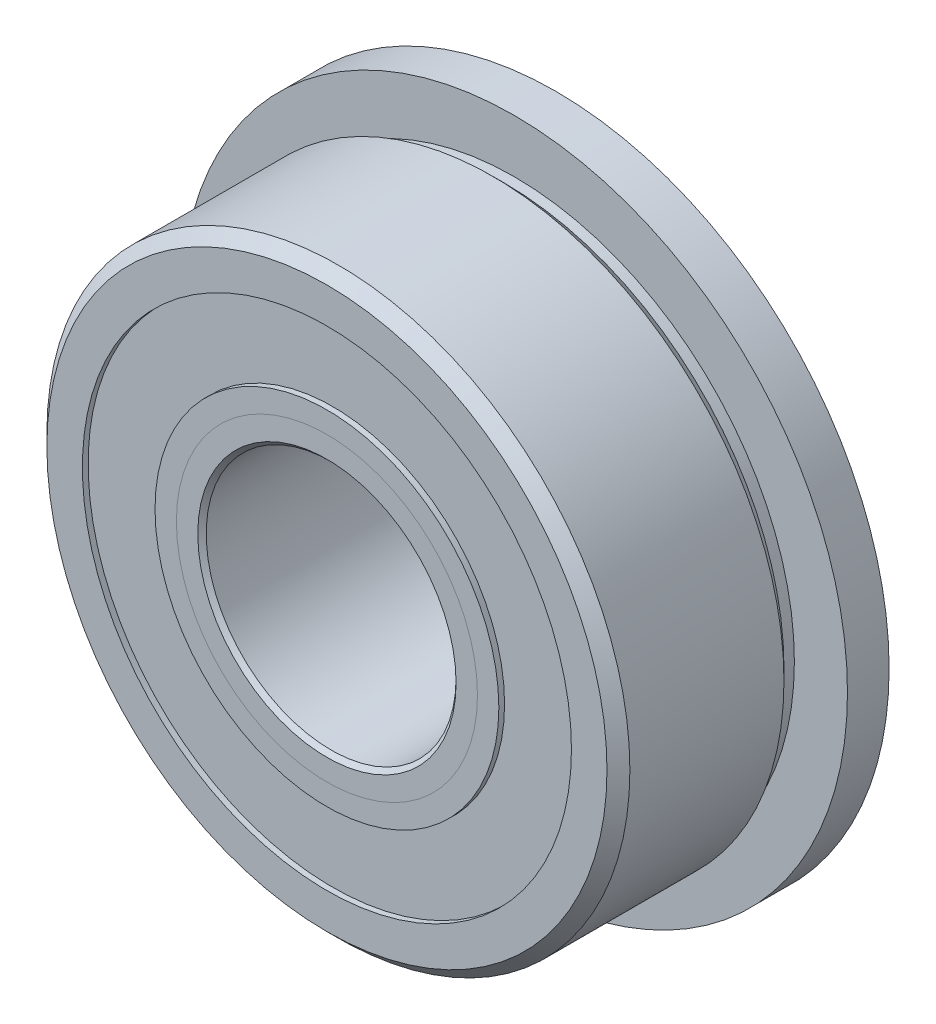
ISO-10303-21;
HEADER;
FILE_DESCRIPTION(('STEP AP214'),'2;1');
FILE_NAME('part.step','',(''),(''),'','','');
FILE_SCHEMA(('AUTOMOTIVE_DESIGN { 1 0 10303 214 1 1 1 1 }'));
ENDSEC;
DATA;
#1=APPLICATION_CONTEXT('core data for automotive mechanical design processes');
#2=APPLICATION_PROTOCOL_DEFINITION('international standard','automotive_design',2000,#1);
#3=PRODUCT_CONTEXT('',#1,'mechanical');
#4=PRODUCT('Part','Part','',(#3));
#5=PRODUCT_RELATED_PRODUCT_CATEGORY('part','',(#4));
#6=PRODUCT_DEFINITION_FORMATION('','',#4);
#7=PRODUCT_DEFINITION_CONTEXT('part definition',#1,'design');
#8=PRODUCT_DEFINITION('design','',#6,#7);
#9=PRODUCT_DEFINITION_SHAPE('','',#8);
#10=(LENGTH_UNIT() NAMED_UNIT(*) SI_UNIT(.MILLI.,.METRE.));
#11=(NAMED_UNIT(*) PLANE_ANGLE_UNIT() SI_UNIT($,.RADIAN.));
#12=(NAMED_UNIT(*) SI_UNIT($,.STERADIAN.) SOLID_ANGLE_UNIT());
#13=UNCERTAINTY_MEASURE_WITH_UNIT(LENGTH_MEASURE(1.E-05),#10,'distance_accuracy_value','');
#14=(GEOMETRIC_REPRESENTATION_CONTEXT(3) GLOBAL_UNCERTAINTY_ASSIGNED_CONTEXT((#13)) GLOBAL_UNIT_ASSIGNED_CONTEXT((#10,
#11,#12)) REPRESENTATION_CONTEXT('',''));
#15=CARTESIAN_POINT('',(0.,0.,0.));
#16=DIRECTION('',(0.,0.,1.));
#17=DIRECTION('',(1.,0.,0.));
#18=AXIS2_PLACEMENT_3D('',#15,#16,#17);
#19=CARTESIAN_POINT('',(0.,0.,4.365625));
#20=DIRECTION('',(0.,0.,1.));
#21=DIRECTION('',(1.,0.,0.));
#22=AXIS2_PLACEMENT_3D('',#19,#20,#21);
#23=CYLINDRICAL_SURFACE('',#22,5.9563);
#24=CARTESIAN_POINT('',(0.,0.,-2.85282807245589));
#25=DIRECTION('',(0.,0.,1.));
#26=DIRECTION('',(1.,0.,0.));
#27=AXIS2_PLACEMENT_3D('',#24,#25,#26);
#28=CIRCLE('',#27,5.9563);
#29=CARTESIAN_POINT('',(5.9563,0.,-2.85282807245589));
#30=VERTEX_POINT('',#29);
#31=EDGE_CURVE('E11',#30,#30,#28,.T.);
#32=ORIENTED_EDGE('',*,*,#31,.T.);
#33=EDGE_LOOP('',(#32));
#34=FACE_BOUND('',#33,.T.);
#35=CARTESIAN_POINT('',(0.,0.,-3.89334375));
#36=DIRECTION('',(0.,0.,-1.));
#37=DIRECTION('',(-1.,0.,0.));
#38=AXIS2_PLACEMENT_3D('',#35,#36,#37);
#39=CIRCLE('',#38,5.9563);
#40=CARTESIAN_POINT('',(-5.9563,0.,-3.89334375));
#41=VERTEX_POINT('',#40);
#42=EDGE_CURVE('E68',#41,#41,#39,.T.);
#43=ORIENTED_EDGE('',*,*,#42,.T.);
#44=EDGE_LOOP('',(#43));
#45=FACE_BOUND('',#44,.T.);
#46=ADVANCED_FACE('F47',(#34,#45),#23,.F.);
#47=CARTESIAN_POINT('',(0.,9.32147435897436,-4.14734375));
#48=DIRECTION('',(0.,0.,1.));
#49=DIRECTION('',(1.,0.,0.));
#50=AXIS2_PLACEMENT_3D('',#47,#48,#49);
#51=PLANE('',#50);
#52=CARTESIAN_POINT('',(0.,0.,-4.14734375));
#53=DIRECTION('',(0.,0.,-1.));
#54=DIRECTION('',(-1.,0.,0.));
#55=AXIS2_PLACEMENT_3D('',#52,#53,#54);
#56=CIRCLE('',#55,6.432804);
#57=CARTESIAN_POINT('',(-6.432804,0.,-4.14734375));
#58=VERTEX_POINT('',#57);
#59=EDGE_CURVE('E65',#58,#58,#56,.T.);
#60=ORIENTED_EDGE('',*,*,#59,.F.);
#61=EDGE_LOOP('',(#60));
#62=FACE_BOUND('',#61,.T.);
#63=CARTESIAN_POINT('',(0.,0.,-4.14734375));
#64=DIRECTION('',(0.,0.,1.));
#65=DIRECTION('',(1.,0.,0.));
#66=AXIS2_PLACEMENT_3D('',#63,#64,#65);
#67=CIRCLE('',#66,9.32147435897436);
#68=CARTESIAN_POINT('',(9.32147435897436,0.,-4.14734375));
#69=VERTEX_POINT('',#68);
#70=EDGE_CURVE('E58',#69,#69,#67,.T.);
#71=ORIENTED_EDGE('',*,*,#70,.F.);
#72=EDGE_LOOP('',(#71));
#73=FACE_BOUND('',#72,.T.);
#74=ADVANCED_FACE('F49',(#62,#73),#51,.F.);
#75=CARTESIAN_POINT('',(0.,9.32147435897436,-2.85282807245589));
#76=DIRECTION('',(0.,0.,-1.));
#77=DIRECTION('',(-1.,0.,0.));
#78=AXIS2_PLACEMENT_3D('',#75,#76,#77);
#79=PLANE('',#78);
#80=ORIENTED_EDGE('',*,*,#31,.F.);
#81=EDGE_LOOP('',(#80));
#82=FACE_BOUND('',#81,.T.);
#83=CARTESIAN_POINT('',(0.,0.,-2.85282807245589));
#84=DIRECTION('',(0.,0.,1.));
#85=DIRECTION('',(1.,0.,0.));
#86=AXIS2_PLACEMENT_3D('',#83,#84,#85);
#87=CIRCLE('',#86,9.32147435897436);
#88=CARTESIAN_POINT('',(9.32147435897436,0.,-2.85282807245589));
#89=VERTEX_POINT('',#88);
#90=EDGE_CURVE('E54',#89,#89,#87,.T.);
#91=ORIENTED_EDGE('',*,*,#90,.T.);
#92=EDGE_LOOP('',(#91));
#93=FACE_BOUND('',#92,.T.);
#94=ADVANCED_FACE('F90',(#82,#93),#79,.F.);
#95=CARTESIAN_POINT('',(0.,0.,4.365625));
#96=DIRECTION('',(0.,0.,1.));
#97=DIRECTION('',(1.,0.,0.));
#98=AXIS2_PLACEMENT_3D('',#95,#96,#97);
#99=CYLINDRICAL_SURFACE('',#98,9.32147435897436);
#100=ORIENTED_EDGE('',*,*,#90,.F.);
#101=EDGE_LOOP('',(#100));
#102=FACE_BOUND('',#101,.T.);
#103=ORIENTED_EDGE('',*,*,#70,.T.);
#104=EDGE_LOOP('',(#103));
#105=FACE_BOUND('',#104,.T.);
#106=ADVANCED_FACE('F84',(#102,#105),#99,.T.);
#107=CARTESIAN_POINT('',(0.,0.,-3.89334375));
#108=DIRECTION('',(0.,0.,-1.));
#109=DIRECTION('',(-1.,0.,0.));
#110=AXIS2_PLACEMENT_3D('',#107,#108,#109);
#111=CYLINDRICAL_SURFACE('',#110,6.432804);
#112=CARTESIAN_POINT('',(0.,0.,-3.89334375));
#113=DIRECTION('',(0.,0.,-1.));
#114=DIRECTION('',(-1.,0.,0.));
#115=AXIS2_PLACEMENT_3D('',#112,#113,#114);
#116=CIRCLE('',#115,6.432804);
#117=CARTESIAN_POINT('',(-6.432804,0.,-3.89334375));
#118=VERTEX_POINT('',#117);
#119=EDGE_CURVE('E62',#118,#118,#116,.T.);
#120=ORIENTED_EDGE('',*,*,#119,.F.);
#121=EDGE_LOOP('',(#120));
#122=FACE_BOUND('',#121,.T.);
#123=ORIENTED_EDGE('',*,*,#59,.T.);
#124=EDGE_LOOP('',(#123));
#125=FACE_BOUND('',#124,.T.);
#126=ADVANCED_FACE('F78',(#122,#125),#111,.F.);
#127=CARTESIAN_POINT('',(0.,0.,-3.89334375));
#128=DIRECTION('',(0.,0.,-1.));
#129=DIRECTION('',(-1.,0.,0.));
#130=AXIS2_PLACEMENT_3D('',#127,#128,#129);
#131=PLANE('',#130);
#132=ORIENTED_EDGE('',*,*,#42,.F.);
#133=EDGE_LOOP('',(#132));
#134=FACE_BOUND('',#133,.T.);
#135=ORIENTED_EDGE('',*,*,#119,.T.);
#136=EDGE_LOOP('',(#135));
#137=FACE_BOUND('',#136,.T.);
#138=ADVANCED_FACE('F75',(#134,#137),#131,.T.);
#139=CLOSED_SHELL('',(#46,#74,#94,#106,#126,#138));
#140=MANIFOLD_SOLID_BREP('B2',#139);
#141=CARTESIAN_POINT('',(0.,9.32147435897436,4.14734375));
#142=DIRECTION('',(0.,0.,-1.));
#143=DIRECTION('',(-1.,0.,0.));
#144=AXIS2_PLACEMENT_3D('',#141,#142,#143);
#145=PLANE('',#144);
#146=CARTESIAN_POINT('',(0.,0.,4.14734375));
#147=DIRECTION('',(0.,0.,1.));
#148=DIRECTION('',(1.,0.,0.));
#149=AXIS2_PLACEMENT_3D('',#146,#147,#148);
#150=CIRCLE('',#149,6.55352564102564);
#151=CARTESIAN_POINT('',(6.55352564102564,0.,4.14734375));
#152=VERTEX_POINT('',#151);
#153=EDGE_CURVE('E46',#152,#152,#150,.T.);
#154=ORIENTED_EDGE('',*,*,#153,.F.);
#155=EDGE_LOOP('',(#154));
#156=FACE_BOUND('',#155,.T.);
#157=CARTESIAN_POINT('',(0.,0.,4.14734375));
#158=DIRECTION('',(0.,0.,1.));
#159=DIRECTION('',(1.,0.,0.));
#160=AXIS2_PLACEMENT_3D('',#157,#158,#159);
#161=CIRCLE('',#160,9.32147435897436);
#162=CARTESIAN_POINT('',(9.32147435897436,0.,4.14734375));
#163=VERTEX_POINT('',#162);
#164=EDGE_CURVE('E174',#163,#163,#161,.T.);
#165=ORIENTED_EDGE('',*,*,#164,.T.);
#166=EDGE_LOOP('',(#165));
#167=FACE_BOUND('',#166,.T.);
#168=ADVANCED_FACE('F160',(#156,#167),#145,.F.);
#169=CARTESIAN_POINT('',(0.,0.,4.365625));
#170=DIRECTION('',(0.,0.,1.));
#171=DIRECTION('',(1.,0.,0.));
#172=AXIS2_PLACEMENT_3D('',#169,#170,#171);
#173=CYLINDRICAL_SURFACE('',#172,6.55352564102564);
#174=CARTESIAN_POINT('',(0.,0.,2.85282807245588));
#175=DIRECTION('',(0.,0.,1.));
#176=DIRECTION('',(1.,0.,0.));
#177=AXIS2_PLACEMENT_3D('',#174,#175,#176);
#178=CIRCLE('',#177,6.55352564102564);
#179=CARTESIAN_POINT('',(6.55352564102564,0.,2.85282807245588));
#180=VERTEX_POINT('',#179);
#181=EDGE_CURVE('E166',#180,#180,#178,.T.);
#182=ORIENTED_EDGE('',*,*,#181,.F.);
#183=EDGE_LOOP('',(#182));
#184=FACE_BOUND('',#183,.T.);
#185=ORIENTED_EDGE('',*,*,#153,.T.);
#186=EDGE_LOOP('',(#185));
#187=FACE_BOUND('',#186,.T.);
#188=ADVANCED_FACE('F189',(#184,#187),#173,.F.);
#189=CARTESIAN_POINT('',(0.,9.32147435897436,2.85282807245588));
#190=DIRECTION('',(0.,0.,1.));
#191=DIRECTION('',(1.,0.,0.));
#192=AXIS2_PLACEMENT_3D('',#189,#190,#191);
#193=PLANE('',#192);
#194=CARTESIAN_POINT('',(0.,0.,2.85282807245588));
#195=DIRECTION('',(0.,0.,1.));
#196=DIRECTION('',(1.,0.,0.));
#197=AXIS2_PLACEMENT_3D('',#194,#195,#196);
#198=CIRCLE('',#197,9.32147435897436);
#199=CARTESIAN_POINT('',(9.32147435897436,0.,2.85282807245588));
#200=VERTEX_POINT('',#199);
#201=EDGE_CURVE('E170',#200,#200,#198,.T.);
#202=ORIENTED_EDGE('',*,*,#201,.F.);
#203=EDGE_LOOP('',(#202));
#204=FACE_BOUND('',#203,.T.);
#205=ORIENTED_EDGE('',*,*,#181,.T.);
#206=EDGE_LOOP('',(#205));
#207=FACE_BOUND('',#206,.T.);
#208=ADVANCED_FACE('F184',(#204,#207),#193,.F.);
#209=CARTESIAN_POINT('',(0.,0.,4.365625));
#210=DIRECTION('',(0.,0.,1.));
#211=DIRECTION('',(1.,0.,0.));
#212=AXIS2_PLACEMENT_3D('',#209,#210,#211);
#213=CYLINDRICAL_SURFACE('',#212,9.32147435897436);
#214=ORIENTED_EDGE('',*,*,#164,.F.);
#215=EDGE_LOOP('',(#214));
#216=FACE_BOUND('',#215,.T.);
#217=ORIENTED_EDGE('',*,*,#201,.T.);
#218=EDGE_LOOP('',(#217));
#219=FACE_BOUND('',#218,.T.);
#220=ADVANCED_FACE('F181',(#216,#219),#213,.T.);
#221=CLOSED_SHELL('',(#168,#188,#208,#220));
#222=MANIFOLD_SOLID_BREP('B6',#221);
#223=CARTESIAN_POINT('',(-3.96874999999991,6.87407664253903,0.));
#224=DIRECTION('',(0.,0.,1.));
#225=DIRECTION('',(-0.499999999999989,0.866025403784445,0.));
#226=AXIS2_PLACEMENT_3D('',#223,#224,#225);
#227=SPHERICAL_SURFACE('',#226,2.85282807245588);
#228=CARTESIAN_POINT('',(-3.96874999999991,6.87407664253903,2.85282807245588));
#229=VERTEX_POINT('',#228);
#230=VERTEX_LOOP('',#229);
#231=FACE_BOUND('',#230,.T.);
#232=ADVANCED_FACE('F227',(#231),#227,.T.);
#233=CLOSED_SHELL('',(#232));
#234=MANIFOLD_SOLID_BREP('B41',#233);
#235=CARTESIAN_POINT('',(-6.87407664253894,3.96875000000008,0.));
#236=DIRECTION('',(0.,0.,1.));
#237=DIRECTION('',(-0.866025403784433,0.50000000000001,0.));
#238=AXIS2_PLACEMENT_3D('',#235,#236,#237);
#239=SPHERICAL_SURFACE('',#238,2.85282807245588);
#240=CARTESIAN_POINT('',(-6.87407664253894,3.96875000000008,2.85282807245588));
#241=VERTEX_POINT('',#240);
#242=VERTEX_LOOP('',#241);
#243=FACE_BOUND('',#242,.T.);
#244=ADVANCED_FACE('F245',(#243),#239,.T.);
#245=CLOSED_SHELL('',(#244));
#246=MANIFOLD_SOLID_BREP('B156',#245);
#247=CARTESIAN_POINT('',(-7.9375,0.,0.));
#248=DIRECTION('',(0.,0.,1.));
#249=DIRECTION('',(-1.,0.,0.));
#250=AXIS2_PLACEMENT_3D('',#247,#248,#249);
#251=SPHERICAL_SURFACE('',#250,2.85282807245588);
#252=CARTESIAN_POINT('',(-7.9375,0.,2.85282807245588));
#253=VERTEX_POINT('',#252);
#254=VERTEX_LOOP('',#253);
#255=FACE_BOUND('',#254,.T.);
#256=ADVANCED_FACE('F263',(#255),#251,.T.);
#257=CLOSED_SHELL('',(#256));
#258=MANIFOLD_SOLID_BREP('B223',#257);
#259=CARTESIAN_POINT('',(-6.87407664253902,-3.96874999999994,0.));
#260=DIRECTION('',(0.,0.,1.));
#261=DIRECTION('',(-0.866025403784443,-0.499999999999992,0.));
#262=AXIS2_PLACEMENT_3D('',#259,#260,#261);
#263=SPHERICAL_SURFACE('',#262,2.85282807245588);
#264=CARTESIAN_POINT('',(-6.87407664253902,-3.96874999999994,2.85282807245588));
#265=VERTEX_POINT('',#264);
#266=VERTEX_LOOP('',#265);
#267=FACE_BOUND('',#266,.T.);
#268=ADVANCED_FACE('F281',(#267),#263,.T.);
#269=CLOSED_SHELL('',(#268));
#270=MANIFOLD_SOLID_BREP('B241',#269);
#271=CARTESIAN_POINT('',(-3.96875000000006,-6.87407664253895,0.));
#272=DIRECTION('',(0.,0.,1.));
#273=DIRECTION('',(-0.500000000000007,-0.866025403784435,0.));
#274=AXIS2_PLACEMENT_3D('',#271,#272,#273);
#275=SPHERICAL_SURFACE('',#274,2.85282807245588);
#276=CARTESIAN_POINT('',(-3.96875000000006,-6.87407664253895,2.85282807245588));
#277=VERTEX_POINT('',#276);
#278=VERTEX_LOOP('',#277);
#279=FACE_BOUND('',#278,.T.);
#280=ADVANCED_FACE('F299',(#279),#275,.T.);
#281=CLOSED_SHELL('',(#280));
#282=MANIFOLD_SOLID_BREP('B259',#281);
#283=CARTESIAN_POINT('',(0.,-7.9375,0.));
#284=DIRECTION('',(0.,0.,1.));
#285=DIRECTION('',(0.,-1.,0.));
#286=AXIS2_PLACEMENT_3D('',#283,#284,#285);
#287=SPHERICAL_SURFACE('',#286,2.85282807245588);
#288=CARTESIAN_POINT('',(0.,-7.9375,2.85282807245588));
#289=VERTEX_POINT('',#288);
#290=VERTEX_LOOP('',#289);
#291=FACE_BOUND('',#290,.T.);
#292=ADVANCED_FACE('F317',(#291),#287,.T.);
#293=CLOSED_SHELL('',(#292));
#294=MANIFOLD_SOLID_BREP('B277',#293);
#295=CARTESIAN_POINT('',(3.96874999999996,-6.87407664253901,0.));
#296=DIRECTION('',(0.,0.,1.));
#297=DIRECTION('',(0.499999999999995,-0.866025403784442,0.));
#298=AXIS2_PLACEMENT_3D('',#295,#296,#297);
#299=SPHERICAL_SURFACE('',#298,2.85282807245588);
#300=CARTESIAN_POINT('',(3.96874999999996,-6.87407664253901,2.85282807245588));
#301=VERTEX_POINT('',#300);
#302=VERTEX_LOOP('',#301);
#303=FACE_BOUND('',#302,.T.);
#304=ADVANCED_FACE('F335',(#303),#299,.T.);
#305=CLOSED_SHELL('',(#304));
#306=MANIFOLD_SOLID_BREP('B295',#305);
#307=CARTESIAN_POINT('',(6.87407664253896,-3.96875000000003,0.));
#308=DIRECTION('',(0.,0.,1.));
#309=DIRECTION('',(0.866025403784436,-0.500000000000004,0.));
#310=AXIS2_PLACEMENT_3D('',#307,#308,#309);
#311=SPHERICAL_SURFACE('',#310,2.85282807245588);
#312=CARTESIAN_POINT('',(6.87407664253896,-3.96875000000003,2.85282807245588));
#313=VERTEX_POINT('',#312);
#314=VERTEX_LOOP('',#313);
#315=FACE_BOUND('',#314,.T.);
#316=ADVANCED_FACE('F353',(#315),#311,.T.);
#317=CLOSED_SHELL('',(#316));
#318=MANIFOLD_SOLID_BREP('B313',#317);
#319=CARTESIAN_POINT('',(7.9375,0.,0.));
#320=DIRECTION('',(0.,0.,1.));
#321=DIRECTION('',(1.,0.,0.));
#322=AXIS2_PLACEMENT_3D('',#319,#320,#321);
#323=SPHERICAL_SURFACE('',#322,2.85282807245588);
#324=CARTESIAN_POINT('',(7.9375,0.,2.85282807245588));
#325=VERTEX_POINT('',#324);
#326=VERTEX_LOOP('',#325);
#327=FACE_BOUND('',#326,.T.);
#328=ADVANCED_FACE('F371',(#327),#323,.T.);
#329=CLOSED_SHELL('',(#328));
#330=MANIFOLD_SOLID_BREP('B331',#329);
#331=CARTESIAN_POINT('',(6.87407664253899,3.96874999999998,0.));
#332=DIRECTION('',(0.,0.,1.));
#333=DIRECTION('',(0.86602540378444,0.499999999999998,0.));
#334=AXIS2_PLACEMENT_3D('',#331,#332,#333);
#335=SPHERICAL_SURFACE('',#334,2.85282807245588);
#336=CARTESIAN_POINT('',(6.87407664253899,3.96874999999998,2.85282807245588));
#337=VERTEX_POINT('',#336);
#338=VERTEX_LOOP('',#337);
#339=FACE_BOUND('',#338,.T.);
#340=ADVANCED_FACE('F389',(#339),#335,.T.);
#341=CLOSED_SHELL('',(#340));
#342=MANIFOLD_SOLID_BREP('B349',#341);
#343=CARTESIAN_POINT('',(3.96875000000001,6.87407664253898,0.));
#344=DIRECTION('',(0.,0.,1.));
#345=DIRECTION('',(0.500000000000001,0.866025403784438,0.));
#346=AXIS2_PLACEMENT_3D('',#343,#344,#345);
#347=SPHERICAL_SURFACE('',#346,2.85282807245588);
#348=CARTESIAN_POINT('',(3.96875000000001,6.87407664253898,2.85282807245588));
#349=VERTEX_POINT('',#348);
#350=VERTEX_LOOP('',#349);
#351=FACE_BOUND('',#350,.T.);
#352=ADVANCED_FACE('F407',(#351),#347,.T.);
#353=CLOSED_SHELL('',(#352));
#354=MANIFOLD_SOLID_BREP('B367',#353);
#355=CARTESIAN_POINT('',(0.,7.9375,0.));
#356=DIRECTION('',(0.,0.,1.));
#357=DIRECTION('',(0.,1.,0.));
#358=AXIS2_PLACEMENT_3D('',#355,#356,#357);
#359=SPHERICAL_SURFACE('',#358,2.85282807245588);
#360=CARTESIAN_POINT('',(0.,7.9375,2.85282807245588));
#361=VERTEX_POINT('',#360);
#362=VERTEX_LOOP('',#361);
#363=FACE_BOUND('',#362,.T.);
#364=ADVANCED_FACE('F427',(#363),#359,.T.);
#365=CLOSED_SHELL('',(#364));
#366=MANIFOLD_SOLID_BREP('B385',#365);
#367=CARTESIAN_POINT('',(0.,5.1990625,-5.953125));
#368=DIRECTION('',(0.,0.,1.));
#369=DIRECTION('',(1.,0.,0.));
#370=AXIS2_PLACEMENT_3D('',#367,#368,#369);
#371=PLANE('',#370);
#372=CARTESIAN_POINT('',(0.,0.,-5.953125));
#373=DIRECTION('',(0.,0.,1.));
#374=DIRECTION('',(1.,0.,0.));
#375=AXIS2_PLACEMENT_3D('',#372,#373,#374);
#376=CIRCLE('',#375,5.1990625);
#377=CARTESIAN_POINT('',(5.1990625,0.,-5.953125));
#378=VERTEX_POINT('',#377);
#379=EDGE_CURVE('E473',#378,#378,#376,.T.);
#380=ORIENTED_EDGE('',*,*,#379,.T.);
#381=EDGE_LOOP('',(#380));
#382=FACE_BOUND('',#381,.T.);
#383=CARTESIAN_POINT('',(0.,0.,-5.953125));
#384=DIRECTION('',(0.,0.,-1.));
#385=DIRECTION('',(-1.,0.,0.));
#386=AXIS2_PLACEMENT_3D('',#383,#384,#385);
#387=CIRCLE('',#386,5.45855525);
#388=CARTESIAN_POINT('',(-5.45855525,0.,-5.953125));
#389=VERTEX_POINT('',#388);
#390=EDGE_CURVE('E492',#389,#389,#387,.T.);
#391=ORIENTED_EDGE('',*,*,#390,.T.);
#392=EDGE_LOOP('',(#391));
#393=FACE_BOUND('',#392,.T.);
#394=ADVANCED_FACE('F447',(#382,#393),#371,.F.);
#395=CARTESIAN_POINT('',(0.,5.73855580239885,4.365625));
#396=DIRECTION('',(0.,0.,-1.));
#397=DIRECTION('',(-1.,0.,0.));
#398=AXIS2_PLACEMENT_3D('',#395,#396,#397);
#399=PLANE('',#398);
#400=CARTESIAN_POINT('',(0.,0.,4.365625));
#401=DIRECTION('',(0.,0.,1.));
#402=DIRECTION('',(1.,0.,0.));
#403=AXIS2_PLACEMENT_3D('',#400,#401,#402);
#404=CIRCLE('',#403,4.92358596377206);
#405=CARTESIAN_POINT('',(4.92358596377206,0.,4.365625));
#406=VERTEX_POINT('',#405);
#407=EDGE_CURVE('E482',#406,#406,#404,.T.);
#408=ORIENTED_EDGE('',*,*,#407,.F.);
#409=EDGE_LOOP('',(#408));
#410=FACE_BOUND('',#409,.T.);
#411=CARTESIAN_POINT('',(0.,0.,4.365625));
#412=DIRECTION('',(0.,0.,1.));
#413=DIRECTION('',(1.,0.,0.));
#414=AXIS2_PLACEMENT_3D('',#411,#412,#413);
#415=CIRCLE('',#414,5.73855580239885);
#416=CARTESIAN_POINT('',(5.73855580239885,0.,4.365625));
#417=VERTEX_POINT('',#416);
#418=EDGE_CURVE('E426',#417,#417,#415,.T.);
#419=ORIENTED_EDGE('',*,*,#418,.T.);
#420=EDGE_LOOP('',(#419));
#421=FACE_BOUND('',#420,.T.);
#422=ADVANCED_FACE('F449',(#410,#421),#399,.F.);
#423=CARTESIAN_POINT('',(0.,0.,3.55065516137321));
#424=DIRECTION('',(0.,0.,1.));
#425=DIRECTION('',(1.,0.,0.));
#426=AXIS2_PLACEMENT_3D('',#423,#424,#425);
#427=CONICAL_SURFACE('',#426,4.92358596377206,0.78539816339745);
#428=ORIENTED_EDGE('',*,*,#418,.F.);
#429=EDGE_LOOP('',(#428));
#430=FACE_BOUND('',#429,.T.);
#431=CARTESIAN_POINT('',(0.,0.,3.55065516137321));
#432=DIRECTION('',(0.,0.,1.));
#433=DIRECTION('',(1.,0.,0.));
#434=AXIS2_PLACEMENT_3D('',#431,#432,#433);
#435=CIRCLE('',#434,4.92358596377206);
#436=CARTESIAN_POINT('',(4.92358596377206,0.,3.55065516137321));
#437=VERTEX_POINT('',#436);
#438=EDGE_CURVE('E454',#437,#437,#435,.T.);
#439=ORIENTED_EDGE('',*,*,#438,.T.);
#440=EDGE_LOOP('',(#439));
#441=FACE_BOUND('',#440,.T.);
#442=ADVANCED_FACE('F538',(#430,#441),#427,.T.);
#443=CARTESIAN_POINT('',(0.,0.,4.365625));
#444=DIRECTION('',(0.,0.,1.));
#445=DIRECTION('',(1.,0.,0.));
#446=AXIS2_PLACEMENT_3D('',#443,#444,#445);
#447=CYLINDRICAL_SURFACE('',#446,4.92358596377206);
#448=ORIENTED_EDGE('',*,*,#438,.F.);
#449=EDGE_LOOP('',(#448));
#450=FACE_BOUND('',#449,.T.);
#451=CARTESIAN_POINT('',(0.,0.,0.));
#452=DIRECTION('',(0.,0.,1.));
#453=DIRECTION('',(1.,0.,0.));
#454=AXIS2_PLACEMENT_3D('',#451,#452,#453);
#455=CIRCLE('',#454,4.92358596377206);
#456=CARTESIAN_POINT('',(4.92358596377206,0.,0.));
#457=VERTEX_POINT('',#456);
#458=EDGE_CURVE('E458',#457,#457,#455,.T.);
#459=ORIENTED_EDGE('',*,*,#458,.T.);
#460=EDGE_LOOP('',(#459));
#461=FACE_BOUND('',#460,.T.);
#462=ADVANCED_FACE('F614',(#450,#461),#447,.T.);
#463=CARTESIAN_POINT('',(0.,4.92358596377206,0.));
#464=DIRECTION('',(0.,0.,-1.));
#465=DIRECTION('',(-1.,0.,0.));
#466=AXIS2_PLACEMENT_3D('',#463,#464,#465);
#467=PLANE('',#466);
#468=ORIENTED_EDGE('',*,*,#458,.F.);
#469=EDGE_LOOP('',(#468));
#470=FACE_BOUND('',#469,.T.);
#471=CARTESIAN_POINT('',(0.,0.,0.));
#472=DIRECTION('',(0.,0.,1.));
#473=DIRECTION('',(1.,0.,0.));
#474=AXIS2_PLACEMENT_3D('',#471,#472,#473);
#475=CIRCLE('',#474,5.08467192754412);
#476=CARTESIAN_POINT('',(5.08467192754412,0.,0.));
#477=VERTEX_POINT('',#476);
#478=EDGE_CURVE('E462',#477,#477,#475,.T.);
#479=ORIENTED_EDGE('',*,*,#478,.T.);
#480=EDGE_LOOP('',(#479));
#481=FACE_BOUND('',#480,.T.);
#482=ADVANCED_FACE('F529',(#470,#481),#467,.F.);
#483=CARTESIAN_POINT('',(0.,0.,0.));
#484=DIRECTION('',(0.,0.,1.));
#485=DIRECTION('',(1.,0.,0.));
#486=AXIS2_PLACEMENT_3D('',#483,#484,#485);
#487=TOROIDAL_SURFACE('',#486,7.9375,2.85282807245588);
#488=ORIENTED_EDGE('',*,*,#478,.F.);
#489=EDGE_LOOP('',(#488));
#490=FACE_BOUND('',#489,.T.);
#491=CARTESIAN_POINT('',(0.,0.,-2.05267497938479));
#492=DIRECTION('',(0.,0.,1.));
#493=DIRECTION('',(1.,0.,0.));
#494=AXIS2_PLACEMENT_3D('',#491,#492,#493);
#495=CIRCLE('',#494,5.9563);
#496=CARTESIAN_POINT('',(5.9563,0.,-2.05267497938479));
#497=VERTEX_POINT('',#496);
#498=EDGE_CURVE('E467',#497,#497,#495,.T.);
#499=ORIENTED_EDGE('',*,*,#498,.T.);
#500=EDGE_LOOP('',(#499));
#501=FACE_BOUND('',#500,.T.);
#502=ADVANCED_FACE('F523',(#490,#501),#487,.F.);
#503=CARTESIAN_POINT('',(0.,0.,4.365625));
#504=DIRECTION('',(0.,0.,1.));
#505=DIRECTION('',(1.,0.,0.));
#506=AXIS2_PLACEMENT_3D('',#503,#504,#505);
#507=CYLINDRICAL_SURFACE('',#506,5.9563);
#508=ORIENTED_EDGE('',*,*,#498,.F.);
#509=EDGE_LOOP('',(#508));
#510=FACE_BOUND('',#509,.T.);
#511=CARTESIAN_POINT('',(0.,0.,-5.953125));
#512=DIRECTION('',(0.,0.,1.));
#513=DIRECTION('',(1.,0.,0.));
#514=AXIS2_PLACEMENT_3D('',#511,#512,#513);
#515=CIRCLE('',#514,5.9563);
#516=CARTESIAN_POINT('',(5.9563,0.,-5.953125));
#517=VERTEX_POINT('',#516);
#518=EDGE_CURVE('E470',#517,#517,#515,.T.);
#519=ORIENTED_EDGE('',*,*,#518,.T.);
#520=EDGE_LOOP('',(#519));
#521=FACE_BOUND('',#520,.T.);
#522=ADVANCED_FACE('F518',(#510,#521),#507,.T.);
#523=CARTESIAN_POINT('',(0.,0.,-5.953125));
#524=DIRECTION('',(0.,0.,-1.));
#525=DIRECTION('',(-1.,0.,0.));
#526=AXIS2_PLACEMENT_3D('',#523,#524,#525);
#527=CIRCLE('',#526,5.69680725);
#528=CARTESIAN_POINT('',(-5.69680725,0.,-5.953125));
#529=VERTEX_POINT('',#528);
#530=EDGE_CURVE('E486',#529,#529,#527,.T.);
#531=ORIENTED_EDGE('',*,*,#530,.F.);
#532=EDGE_LOOP('',(#531));
#533=FACE_BOUND('',#532,.T.);
#534=ORIENTED_EDGE('',*,*,#518,.F.);
#535=EDGE_LOOP('',(#534));
#536=FACE_BOUND('',#535,.T.);
#537=ADVANCED_FACE('F514',(#533,#536),#371,.F.);
#538=CARTESIAN_POINT('',(0.,0.,-5.5165625));
#539=DIRECTION('',(0.,0.,-1.));
#540=DIRECTION('',(-1.,0.,0.));
#541=AXIS2_PLACEMENT_3D('',#538,#539,#540);
#542=CONICAL_SURFACE('',#541,4.7625,0.785398163397448);
#543=ORIENTED_EDGE('',*,*,#379,.F.);
#544=EDGE_LOOP('',(#543));
#545=FACE_BOUND('',#544,.T.);
#546=CARTESIAN_POINT('',(0.,0.,-5.5165625));
#547=DIRECTION('',(0.,0.,1.));
#548=DIRECTION('',(1.,0.,0.));
#549=AXIS2_PLACEMENT_3D('',#546,#547,#548);
#550=CIRCLE('',#549,4.7625);
#551=CARTESIAN_POINT('',(4.7625,0.,-5.5165625));
#552=VERTEX_POINT('',#551);
#553=EDGE_CURVE('E476',#552,#552,#550,.T.);
#554=ORIENTED_EDGE('',*,*,#553,.T.);
#555=EDGE_LOOP('',(#554));
#556=FACE_BOUND('',#555,.T.);
#557=ADVANCED_FACE('F517',(#545,#556),#542,.F.);
#558=CARTESIAN_POINT('',(0.,0.,4.365625));
#559=DIRECTION('',(0.,0.,1.));
#560=DIRECTION('',(1.,0.,0.));
#561=AXIS2_PLACEMENT_3D('',#558,#559,#560);
#562=CYLINDRICAL_SURFACE('',#561,4.7625);
#563=ORIENTED_EDGE('',*,*,#553,.F.);
#564=EDGE_LOOP('',(#563));
#565=FACE_BOUND('',#564,.T.);
#566=CARTESIAN_POINT('',(0.,0.,4.20453903622794));
#567=DIRECTION('',(0.,0.,1.));
#568=DIRECTION('',(1.,0.,0.));
#569=AXIS2_PLACEMENT_3D('',#566,#567,#568);
#570=CIRCLE('',#569,4.7625);
#571=CARTESIAN_POINT('',(4.7625,0.,4.20453903622794));
#572=VERTEX_POINT('',#571);
#573=EDGE_CURVE('E479',#572,#572,#570,.T.);
#574=ORIENTED_EDGE('',*,*,#573,.T.);
#575=EDGE_LOOP('',(#574));
#576=FACE_BOUND('',#575,.T.);
#577=ADVANCED_FACE('F544',(#565,#576),#562,.F.);
#578=CARTESIAN_POINT('',(0.,0.,4.365625));
#579=DIRECTION('',(0.,0.,1.));
#580=DIRECTION('',(1.,0.,0.));
#581=AXIS2_PLACEMENT_3D('',#578,#579,#580);
#582=CONICAL_SURFACE('',#581,4.92358596377206,0.785398163397448);
#583=ORIENTED_EDGE('',*,*,#573,.F.);
#584=EDGE_LOOP('',(#583));
#585=FACE_BOUND('',#584,.T.);
#586=ORIENTED_EDGE('',*,*,#407,.T.);
#587=EDGE_LOOP('',(#586));
#588=FACE_BOUND('',#587,.T.);
#589=ADVANCED_FACE('F510',(#585,#588),#582,.F.);
#590=CARTESIAN_POINT('',(0.,0.,-5.826125));
#591=DIRECTION('',(0.,0.,-1.));
#592=DIRECTION('',(-1.,0.,0.));
#593=AXIS2_PLACEMENT_3D('',#590,#591,#592);
#594=CYLINDRICAL_SURFACE('',#593,5.69680725);
#595=CARTESIAN_POINT('',(0.,0.,-5.826125));
#596=DIRECTION('',(0.,0.,-1.));
#597=DIRECTION('',(-1.,0.,0.));
#598=AXIS2_PLACEMENT_3D('',#595,#596,#597);
#599=CIRCLE('',#598,5.69680725);
#600=CARTESIAN_POINT('',(-5.69680725,0.,-5.826125));
#601=VERTEX_POINT('',#600);
#602=EDGE_CURVE('E485',#601,#601,#599,.T.);
#603=ORIENTED_EDGE('',*,*,#602,.F.);
#604=EDGE_LOOP('',(#603));
#605=FACE_BOUND('',#604,.T.);
#606=ORIENTED_EDGE('',*,*,#530,.T.);
#607=EDGE_LOOP('',(#606));
#608=FACE_BOUND('',#607,.T.);
#609=ADVANCED_FACE('F504',(#605,#608),#594,.F.);
#610=CARTESIAN_POINT('',(0.,0.,-5.826125));
#611=DIRECTION('',(0.,0.,-1.));
#612=DIRECTION('',(-1.,0.,0.));
#613=AXIS2_PLACEMENT_3D('',#610,#611,#612);
#614=PLANE('',#613);
#615=CARTESIAN_POINT('',(0.,0.,-5.826125));
#616=DIRECTION('',(0.,0.,-1.));
#617=DIRECTION('',(-1.,0.,0.));
#618=AXIS2_PLACEMENT_3D('',#615,#616,#617);
#619=CIRCLE('',#618,5.45855525);
#620=CARTESIAN_POINT('',(-5.45855525,0.,-5.826125));
#621=VERTEX_POINT('',#620);
#622=EDGE_CURVE('E489',#621,#621,#619,.T.);
#623=ORIENTED_EDGE('',*,*,#622,.F.);
#624=EDGE_LOOP('',(#623));
#625=FACE_BOUND('',#624,.T.);
#626=ORIENTED_EDGE('',*,*,#602,.T.);
#627=EDGE_LOOP('',(#626));
#628=FACE_BOUND('',#627,.T.);
#629=ADVANCED_FACE('F501',(#625,#628),#614,.T.);
#630=CARTESIAN_POINT('',(0.,0.,-5.826125));
#631=DIRECTION('',(0.,0.,-1.));
#632=DIRECTION('',(-1.,0.,0.));
#633=AXIS2_PLACEMENT_3D('',#630,#631,#632);
#634=CYLINDRICAL_SURFACE('',#633,5.45855525);
#635=ORIENTED_EDGE('',*,*,#622,.T.);
#636=EDGE_LOOP('',(#635));
#637=FACE_BOUND('',#636,.T.);
#638=ORIENTED_EDGE('',*,*,#390,.F.);
#639=EDGE_LOOP('',(#638));
#640=FACE_BOUND('',#639,.T.);
#641=ADVANCED_FACE('F498',(#637,#640),#634,.T.);
#642=CLOSED_SHELL('',(#394,#422,#442,#462,#482,#502,#522,#537,#557,#577,#589,#609,#629,#641));
#643=MANIFOLD_SOLID_BREP('B403',#642);
#644=CARTESIAN_POINT('',(0.,6.55352564102564,4.365625));
#645=DIRECTION('',(0.,0.,-1.));
#646=DIRECTION('',(-1.,0.,0.));
#647=AXIS2_PLACEMENT_3D('',#644,#645,#646);
#648=PLANE('',#647);
#649=CARTESIAN_POINT('',(0.,0.,4.365625));
#650=DIRECTION('',(0.,0.,1.));
#651=DIRECTION('',(1.,0.,0.));
#652=AXIS2_PLACEMENT_3D('',#649,#650,#651);
#653=CIRCLE('',#652,5.73855580239885);
#654=CARTESIAN_POINT('',(5.73855580239885,0.,4.365625));
#655=VERTEX_POINT('',#654);
#656=EDGE_CURVE('E446',#655,#655,#653,.T.);
#657=ORIENTED_EDGE('',*,*,#656,.F.);
#658=EDGE_LOOP('',(#657));
#659=FACE_BOUND('',#658,.T.);
#660=CARTESIAN_POINT('',(0.,0.,4.365625));
#661=DIRECTION('',(0.,0.,1.));
#662=DIRECTION('',(1.,0.,0.));
#663=AXIS2_PLACEMENT_3D('',#660,#661,#662);
#664=CIRCLE('',#663,6.55352564102564);
#665=CARTESIAN_POINT('',(6.55352564102564,0.,4.365625));
#666=VERTEX_POINT('',#665);
#667=EDGE_CURVE('E686',#666,#666,#664,.T.);
#668=ORIENTED_EDGE('',*,*,#667,.T.);
#669=EDGE_LOOP('',(#668));
#670=FACE_BOUND('',#669,.T.);
#671=ADVANCED_FACE('F664',(#659,#670),#648,.F.);
#672=CARTESIAN_POINT('',(0.,0.,4.365625));
#673=DIRECTION('',(0.,0.,1.));
#674=DIRECTION('',(1.,0.,0.));
#675=AXIS2_PLACEMENT_3D('',#672,#673,#674);
#676=CONICAL_SURFACE('',#675,5.73855580239885,0.78539816339745);
#677=CARTESIAN_POINT('',(0.,0.,3.55065516137321));
#678=DIRECTION('',(0.,0.,1.));
#679=DIRECTION('',(1.,0.,0.));
#680=AXIS2_PLACEMENT_3D('',#677,#678,#679);
#681=CIRCLE('',#680,4.92358596377206);
#682=CARTESIAN_POINT('',(4.92358596377206,0.,3.55065516137321));
#683=VERTEX_POINT('',#682);
#684=EDGE_CURVE('E670',#683,#683,#681,.T.);
#685=ORIENTED_EDGE('',*,*,#684,.F.);
#686=EDGE_LOOP('',(#685));
#687=FACE_BOUND('',#686,.T.);
#688=ORIENTED_EDGE('',*,*,#656,.T.);
#689=EDGE_LOOP('',(#688));
#690=FACE_BOUND('',#689,.T.);
#691=ADVANCED_FACE('F711',(#687,#690),#676,.F.);
#692=CARTESIAN_POINT('',(0.,0.,4.365625));
#693=DIRECTION('',(0.,0.,1.));
#694=DIRECTION('',(1.,0.,0.));
#695=AXIS2_PLACEMENT_3D('',#692,#693,#694);
#696=CYLINDRICAL_SURFACE('',#695,4.92358596377206);
#697=CARTESIAN_POINT('',(0.,0.,0.));
#698=DIRECTION('',(0.,0.,1.));
#699=DIRECTION('',(1.,0.,0.));
#700=AXIS2_PLACEMENT_3D('',#697,#698,#699);
#701=CIRCLE('',#700,4.92358596377206);
#702=CARTESIAN_POINT('',(4.92358596377206,0.,0.));
#703=VERTEX_POINT('',#702);
#704=EDGE_CURVE('E674',#703,#703,#701,.T.);
#705=ORIENTED_EDGE('',*,*,#704,.F.);
#706=EDGE_LOOP('',(#705));
#707=FACE_BOUND('',#706,.T.);
#708=ORIENTED_EDGE('',*,*,#684,.T.);
#709=EDGE_LOOP('',(#708));
#710=FACE_BOUND('',#709,.T.);
#711=ADVANCED_FACE('F706',(#707,#710),#696,.F.);
#712=CARTESIAN_POINT('',(0.,4.92358596377206,0.));
#713=DIRECTION('',(0.,0.,1.));
#714=DIRECTION('',(1.,0.,0.));
#715=AXIS2_PLACEMENT_3D('',#712,#713,#714);
#716=PLANE('',#715);
#717=CARTESIAN_POINT('',(0.,0.,0.));
#718=DIRECTION('',(0.,0.,1.));
#719=DIRECTION('',(1.,0.,0.));
#720=AXIS2_PLACEMENT_3D('',#717,#718,#719);
#721=CIRCLE('',#720,5.08467192754412);
#722=CARTESIAN_POINT('',(5.08467192754412,0.,0.));
#723=VERTEX_POINT('',#722);
#724=EDGE_CURVE('E678',#723,#723,#721,.T.);
#725=ORIENTED_EDGE('',*,*,#724,.F.);
#726=EDGE_LOOP('',(#725));
#727=FACE_BOUND('',#726,.T.);
#728=ORIENTED_EDGE('',*,*,#704,.T.);
#729=EDGE_LOOP('',(#728));
#730=FACE_BOUND('',#729,.T.);
#731=ADVANCED_FACE('F700',(#727,#730),#716,.F.);
#732=CARTESIAN_POINT('',(0.,0.,0.));
#733=DIRECTION('',(0.,0.,1.));
#734=DIRECTION('',(1.,0.,0.));
#735=AXIS2_PLACEMENT_3D('',#732,#733,#734);
#736=TOROIDAL_SURFACE('',#735,7.9375,2.85282807245588);
#737=CARTESIAN_POINT('',(0.,0.,2.49464285714286));
#738=DIRECTION('',(0.,0.,1.));
#739=DIRECTION('',(1.,0.,0.));
#740=AXIS2_PLACEMENT_3D('',#737,#738,#739);
#741=CIRCLE('',#740,6.55352564102564);
#742=CARTESIAN_POINT('',(6.55352564102564,0.,2.49464285714286));
#743=VERTEX_POINT('',#742);
#744=EDGE_CURVE('E683',#743,#743,#741,.T.);
#745=ORIENTED_EDGE('',*,*,#744,.F.);
#746=EDGE_LOOP('',(#745));
#747=FACE_BOUND('',#746,.T.);
#748=ORIENTED_EDGE('',*,*,#724,.T.);
#749=EDGE_LOOP('',(#748));
#750=FACE_BOUND('',#749,.T.);
#751=ADVANCED_FACE('F694',(#747,#750),#736,.F.);
#752=CARTESIAN_POINT('',(0.,0.,4.365625));
#753=DIRECTION('',(0.,0.,1.));
#754=DIRECTION('',(1.,0.,0.));
#755=AXIS2_PLACEMENT_3D('',#752,#753,#754);
#756=CYLINDRICAL_SURFACE('',#755,6.55352564102564);
#757=ORIENTED_EDGE('',*,*,#667,.F.);
#758=EDGE_LOOP('',(#757));
#759=FACE_BOUND('',#758,.T.);
#760=ORIENTED_EDGE('',*,*,#744,.T.);
#761=EDGE_LOOP('',(#760));
#762=FACE_BOUND('',#761,.T.);
#763=ADVANCED_FACE('F691',(#759,#762),#756,.T.);
#764=CLOSED_SHELL('',(#671,#691,#711,#731,#751,#763));
#765=MANIFOLD_SOLID_BREP('B421',#764);
#766=CARTESIAN_POINT('',(0.,0.,4.365625));
#767=DIRECTION('',(0.,0.,1.));
#768=DIRECTION('',(1.,0.,0.));
#769=AXIS2_PLACEMENT_3D('',#766,#767,#768);
#770=CYLINDRICAL_SURFACE('',#769,11.1125);
#771=CARTESIAN_POINT('',(0.,0.,3.9290625));
#772=DIRECTION('',(0.,0.,1.));
#773=DIRECTION('',(1.,0.,0.));
#774=AXIS2_PLACEMENT_3D('',#771,#772,#773);
#775=CIRCLE('',#774,11.1125);
#776=CARTESIAN_POINT('',(11.1125,0.,3.9290625));
#777=VERTEX_POINT('',#776);
#778=EDGE_CURVE('E766',#777,#777,#775,.T.);
#779=ORIENTED_EDGE('',*,*,#778,.F.);
#780=EDGE_LOOP('',(#779));
#781=FACE_BOUND('',#780,.T.);
#782=CARTESIAN_POINT('',(0.,0.,-1.9446875));
#783=DIRECTION('',(0.,0.,1.));
#784=DIRECTION('',(1.,0.,0.));
#785=AXIS2_PLACEMENT_3D('',#782,#783,#784);
#786=CIRCLE('',#785,11.1125);
#787=CARTESIAN_POINT('',(11.1125,0.,-1.9446875));
#788=VERTEX_POINT('',#787);
#789=EDGE_CURVE('E793',#788,#788,#786,.T.);
#790=ORIENTED_EDGE('',*,*,#789,.T.);
#791=EDGE_LOOP('',(#790));
#792=FACE_BOUND('',#791,.T.);
#793=ADVANCED_FACE('F755',(#781,#792),#770,.T.);
#794=CARTESIAN_POINT('',(0.,0.,0.));
#795=DIRECTION('',(0.,0.,1.));
#796=DIRECTION('',(1.,0.,0.));
#797=AXIS2_PLACEMENT_3D('',#794,#795,#796);
#798=TOROIDAL_SURFACE('',#797,7.9375,2.85282807245588);
#799=CARTESIAN_POINT('',(0.,0.,2.49464285714286));
#800=DIRECTION('',(0.,0.,1.));
#801=DIRECTION('',(1.,0.,0.));
#802=AXIS2_PLACEMENT_3D('',#799,#800,#801);
#803=CIRCLE('',#802,9.32147435897436);
#804=CARTESIAN_POINT('',(9.32147435897436,0.,2.49464285714286));
#805=VERTEX_POINT('',#804);
#806=EDGE_CURVE('E778',#805,#805,#803,.T.);
#807=ORIENTED_EDGE('',*,*,#806,.T.);
#808=EDGE_LOOP('',(#807));
#809=FACE_BOUND('',#808,.T.);
#810=CARTESIAN_POINT('',(0.,0.,-2.49464285714286));
#811=DIRECTION('',(0.,0.,1.));
#812=DIRECTION('',(1.,0.,0.));
#813=AXIS2_PLACEMENT_3D('',#810,#811,#812);
#814=CIRCLE('',#813,9.32147435897436);
#815=CARTESIAN_POINT('',(9.32147435897436,0.,-2.49464285714286));
#816=VERTEX_POINT('',#815);
#817=EDGE_CURVE('E663',#816,#816,#814,.T.);
#818=ORIENTED_EDGE('',*,*,#817,.F.);
#819=EDGE_LOOP('',(#818));
#820=FACE_BOUND('',#819,.T.);
#821=ADVANCED_FACE('F757',(#809,#820),#798,.F.);
#822=CARTESIAN_POINT('',(0.,0.,4.365625));
#823=DIRECTION('',(0.,0.,1.));
#824=DIRECTION('',(1.,0.,0.));
#825=AXIS2_PLACEMENT_3D('',#822,#823,#824);
#826=CYLINDRICAL_SURFACE('',#825,9.32147435897436);
#827=ORIENTED_EDGE('',*,*,#817,.T.);
#828=EDGE_LOOP('',(#827));
#829=FACE_BOUND('',#828,.T.);
#830=CARTESIAN_POINT('',(0.,0.,-4.365625));
#831=DIRECTION('',(0.,0.,1.));
#832=DIRECTION('',(1.,0.,0.));
#833=AXIS2_PLACEMENT_3D('',#830,#831,#832);
#834=CIRCLE('',#833,9.32147435897436);
#835=CARTESIAN_POINT('',(9.32147435897436,0.,-4.365625));
#836=VERTEX_POINT('',#835);
#837=EDGE_CURVE('E762',#836,#836,#834,.T.);
#838=ORIENTED_EDGE('',*,*,#837,.F.);
#839=EDGE_LOOP('',(#838));
#840=FACE_BOUND('',#839,.T.);
#841=ADVANCED_FACE('F815',(#829,#840),#826,.F.);
#842=CARTESIAN_POINT('',(0.,0.,-4.365625));
#843=DIRECTION('',(0.,0.,-1.));
#844=DIRECTION('',(-1.,0.,0.));
#845=AXIS2_PLACEMENT_3D('',#842,#843,#844);
#846=PLANE('',#845);
#847=ORIENTED_EDGE('',*,*,#837,.T.);
#848=EDGE_LOOP('',(#847));
#849=FACE_BOUND('',#848,.T.);
#850=CARTESIAN_POINT('',(0.,0.,-4.365625));
#851=DIRECTION('',(0.,0.,-1.));
#852=DIRECTION('',(-1.,0.,0.));
#853=AXIS2_PLACEMENT_3D('',#850,#851,#852);
#854=CIRCLE('',#853,12.7);
#855=CARTESIAN_POINT('',(-12.7,0.,-4.365625));
#856=VERTEX_POINT('',#855);
#857=EDGE_CURVE('E781',#856,#856,#854,.T.);
#858=ORIENTED_EDGE('',*,*,#857,.T.);
#859=EDGE_LOOP('',(#858));
#860=FACE_BOUND('',#859,.T.);
#861=ADVANCED_FACE('F822',(#849,#860),#846,.T.);
#862=CARTESIAN_POINT('',(0.,0.,3.9290625));
#863=DIRECTION('',(0.,0.,-1.));
#864=DIRECTION('',(-1.,0.,0.));
#865=AXIS2_PLACEMENT_3D('',#862,#863,#864);
#866=CONICAL_SURFACE('',#865,11.1125,0.785398163397445);
#867=CARTESIAN_POINT('',(0.,0.,4.365625));
#868=DIRECTION('',(0.,0.,1.));
#869=DIRECTION('',(1.,0.,0.));
#870=AXIS2_PLACEMENT_3D('',#867,#868,#869);
#871=CIRCLE('',#870,10.6759375);
#872=CARTESIAN_POINT('',(10.6759375,0.,4.365625));
#873=VERTEX_POINT('',#872);
#874=EDGE_CURVE('E770',#873,#873,#871,.T.);
#875=ORIENTED_EDGE('',*,*,#874,.F.);
#876=EDGE_LOOP('',(#875));
#877=FACE_BOUND('',#876,.T.);
#878=ORIENTED_EDGE('',*,*,#778,.T.);
#879=EDGE_LOOP('',(#878));
#880=FACE_BOUND('',#879,.T.);
#881=ADVANCED_FACE('F820',(#877,#880),#866,.T.);
#882=CARTESIAN_POINT('',(0.,0.,4.365625));
#883=DIRECTION('',(0.,0.,-1.));
#884=DIRECTION('',(-1.,0.,0.));
#885=AXIS2_PLACEMENT_3D('',#882,#883,#884);
#886=PLANE('',#885);
#887=CARTESIAN_POINT('',(0.,0.,4.365625));
#888=DIRECTION('',(0.,0.,1.));
#889=DIRECTION('',(1.,0.,0.));
#890=AXIS2_PLACEMENT_3D('',#887,#888,#889);
#891=CIRCLE('',#890,9.32147435897436);
#892=CARTESIAN_POINT('',(9.32147435897436,0.,4.365625));
#893=VERTEX_POINT('',#892);
#894=EDGE_CURVE('E775',#893,#893,#891,.T.);
#895=ORIENTED_EDGE('',*,*,#894,.F.);
#896=EDGE_LOOP('',(#895));
#897=FACE_BOUND('',#896,.T.);
#898=ORIENTED_EDGE('',*,*,#874,.T.);
#899=EDGE_LOOP('',(#898));
#900=FACE_BOUND('',#899,.T.);
#901=ADVANCED_FACE('F842',(#897,#900),#886,.F.);
#902=CARTESIAN_POINT('',(0.,0.,4.365625));
#903=DIRECTION('',(0.,0.,1.));
#904=DIRECTION('',(1.,0.,0.));
#905=AXIS2_PLACEMENT_3D('',#902,#903,#904);
#906=CYLINDRICAL_SURFACE('',#905,9.32147435897436);
#907=ORIENTED_EDGE('',*,*,#806,.F.);
#908=EDGE_LOOP('',(#907));
#909=FACE_BOUND('',#908,.T.);
#910=ORIENTED_EDGE('',*,*,#894,.T.);
#911=EDGE_LOOP('',(#910));
#912=FACE_BOUND('',#911,.T.);
#913=ADVANCED_FACE('F849',(#909,#912),#906,.F.);
#914=CARTESIAN_POINT('',(0.,9.99870592948718,-2.778125));
#915=DIRECTION('',(0.,0.,1.));
#916=DIRECTION('',(1.,0.,0.));
#917=AXIS2_PLACEMENT_3D('',#914,#915,#916);
#918=PLANE('',#917);
#919=CARTESIAN_POINT('',(0.,0.,-2.778125));
#920=DIRECTION('',(0.,0.,-1.));
#921=DIRECTION('',(-1.,0.,0.));
#922=AXIS2_PLACEMENT_3D('',#919,#920,#921);
#923=CIRCLE('',#922,12.7);
#924=CARTESIAN_POINT('',(-12.7,0.,-2.778125));
#925=VERTEX_POINT('',#924);
#926=EDGE_CURVE('E784',#925,#925,#923,.T.);
#927=ORIENTED_EDGE('',*,*,#926,.F.);
#928=EDGE_LOOP('',(#927));
#929=FACE_BOUND('',#928,.T.);
#930=CARTESIAN_POINT('',(0.,0.,-2.778125));
#931=DIRECTION('',(0.,0.,1.));
#932=DIRECTION('',(1.,0.,0.));
#933=AXIS2_PLACEMENT_3D('',#930,#931,#932);
#934=CIRCLE('',#933,10.6759375);
#935=CARTESIAN_POINT('',(10.6759375,0.,-2.778125));
#936=VERTEX_POINT('',#935);
#937=EDGE_CURVE('E787',#936,#936,#934,.T.);
#938=ORIENTED_EDGE('',*,*,#937,.F.);
#939=EDGE_LOOP('',(#938));
#940=FACE_BOUND('',#939,.T.);
#941=ADVANCED_FACE('F855',(#929,#940),#918,.T.);
#942=CARTESIAN_POINT('',(0.,0.,-5.953125));
#943=DIRECTION('',(0.,0.,-1.));
#944=DIRECTION('',(-1.,0.,0.));
#945=AXIS2_PLACEMENT_3D('',#942,#943,#944);
#946=CYLINDRICAL_SURFACE('',#945,12.7);
#947=ORIENTED_EDGE('',*,*,#926,.T.);
#948=EDGE_LOOP('',(#947));
#949=FACE_BOUND('',#948,.T.);
#950=ORIENTED_EDGE('',*,*,#857,.F.);
#951=EDGE_LOOP('',(#950));
#952=FACE_BOUND('',#951,.T.);
#953=ADVANCED_FACE('F806',(#949,#952),#946,.T.);
#954=CARTESIAN_POINT('',(0.,0.,4.365625));
#955=DIRECTION('',(0.,0.,1.));
#956=DIRECTION('',(1.,0.,0.));
#957=AXIS2_PLACEMENT_3D('',#954,#955,#956);
#958=CYLINDRICAL_SURFACE('',#957,10.6759375);
#959=ORIENTED_EDGE('',*,*,#937,.T.);
#960=EDGE_LOOP('',(#959));
#961=FACE_BOUND('',#960,.T.);
#962=CARTESIAN_POINT('',(0.,0.,-2.38125));
#963=DIRECTION('',(0.,0.,1.));
#964=DIRECTION('',(1.,0.,0.));
#965=AXIS2_PLACEMENT_3D('',#962,#963,#964);
#966=CIRCLE('',#965,10.6759375);
#967=CARTESIAN_POINT('',(10.6759375,0.,-2.38125));
#968=VERTEX_POINT('',#967);
#969=EDGE_CURVE('E790',#968,#968,#966,.T.);
#970=ORIENTED_EDGE('',*,*,#969,.F.);
#971=EDGE_LOOP('',(#970));
#972=FACE_BOUND('',#971,.T.);
#973=ADVANCED_FACE('F800',(#961,#972),#958,.T.);
#974=CARTESIAN_POINT('',(0.,0.,-1.9446875));
#975=DIRECTION('',(0.,0.,1.));
#976=DIRECTION('',(1.,0.,0.));
#977=AXIS2_PLACEMENT_3D('',#974,#975,#976);
#978=CONICAL_SURFACE('',#977,11.1125,0.785398163397444);
#979=ORIENTED_EDGE('',*,*,#969,.T.);
#980=EDGE_LOOP('',(#979));
#981=FACE_BOUND('',#980,.T.);
#982=ORIENTED_EDGE('',*,*,#789,.F.);
#983=EDGE_LOOP('',(#982));
#984=FACE_BOUND('',#983,.T.);
#985=ADVANCED_FACE('F798',(#981,#984),#978,.T.);
#986=CLOSED_SHELL('',(#793,#821,#841,#861,#881,#901,#913,#941,#953,#973,#985));
#987=MANIFOLD_SOLID_BREP('B441',#986);
#988=ADVANCED_BREP_SHAPE_REPRESENTATION('',(#18,#140,#222,#234,#246,#258,#270,#282,#294,#306,
#318,#330,#342,#354,#366,#643,#765,#987),#14);
#989=SHAPE_DEFINITION_REPRESENTATION(#9,#988);
ENDSEC;
END-ISO-10303-21;
